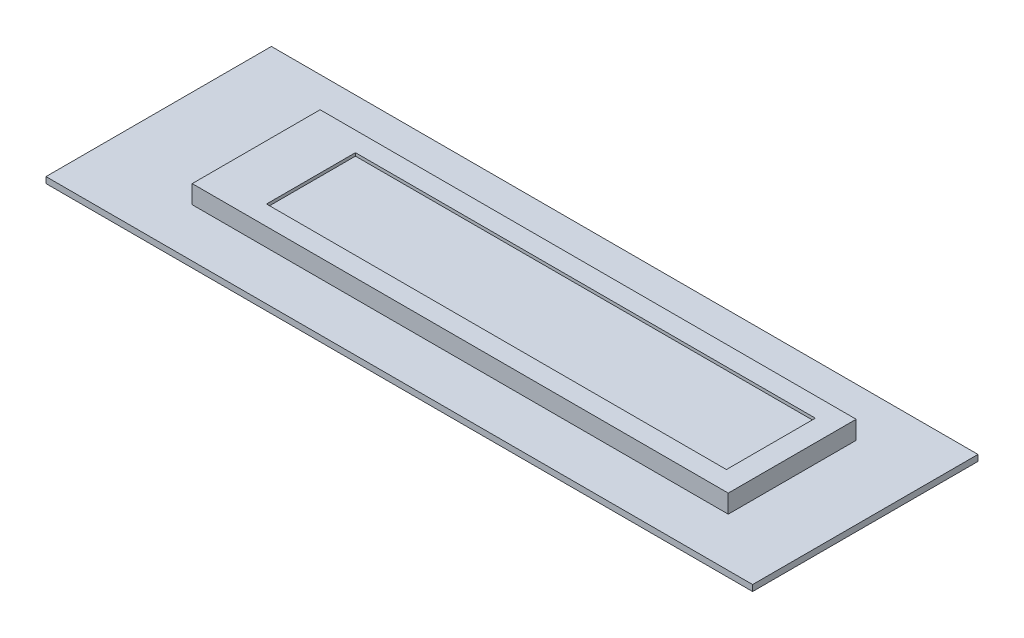
ISO-10303-21;
HEADER;
FILE_DESCRIPTION(('STEP AP214'),'2;1');
FILE_NAME('part.step','',(''),(''),'','','');
FILE_SCHEMA(('AUTOMOTIVE_DESIGN { 1 0 10303 214 1 1 1 1 }'));
ENDSEC;
DATA;
#1=APPLICATION_CONTEXT('core data for automotive mechanical design processes');
#2=APPLICATION_PROTOCOL_DEFINITION('international standard','automotive_design',2000,#1);
#3=PRODUCT_CONTEXT('',#1,'mechanical');
#4=PRODUCT('Part','Part','',(#3));
#5=PRODUCT_RELATED_PRODUCT_CATEGORY('part','',(#4));
#6=PRODUCT_DEFINITION_FORMATION('','',#4);
#7=PRODUCT_DEFINITION_CONTEXT('part definition',#1,'design');
#8=PRODUCT_DEFINITION('design','',#6,#7);
#9=PRODUCT_DEFINITION_SHAPE('','',#8);
#10=(LENGTH_UNIT() NAMED_UNIT(*) SI_UNIT(.MILLI.,.METRE.));
#11=(NAMED_UNIT(*) PLANE_ANGLE_UNIT() SI_UNIT($,.RADIAN.));
#12=(NAMED_UNIT(*) SI_UNIT($,.STERADIAN.) SOLID_ANGLE_UNIT());
#13=UNCERTAINTY_MEASURE_WITH_UNIT(LENGTH_MEASURE(1.E-05),#10,'distance_accuracy_value','');
#14=(GEOMETRIC_REPRESENTATION_CONTEXT(3) GLOBAL_UNCERTAINTY_ASSIGNED_CONTEXT((#13)) GLOBAL_UNIT_ASSIGNED_CONTEXT((#10,
#11,#12)) REPRESENTATION_CONTEXT('',''));
#15=CARTESIAN_POINT('',(0.,0.,0.));
#16=DIRECTION('',(0.,0.,1.));
#17=DIRECTION('',(1.,0.,0.));
#18=AXIS2_PLACEMENT_3D('',#15,#16,#17);
#19=CARTESIAN_POINT('',(0.,1.,0.));
#20=DIRECTION('',(0.,1.,0.));
#21=DIRECTION('',(0.,0.,1.));
#22=AXIS2_PLACEMENT_3D('',#19,#20,#21);
#23=PLANE('',#22);
#24=DIRECTION('',(0.,0.,-1.));
#25=VECTOR('',#24,1.);
#26=CARTESIAN_POINT('',(58.,1.,-18.5));
#27=LINE('',#26,#25);
#28=CARTESIAN_POINT('',(58.,1.,18.5));
#29=VERTEX_POINT('',#28);
#30=CARTESIAN_POINT('',(58.,1.,-18.5));
#31=VERTEX_POINT('',#30);
#32=EDGE_CURVE('E189',#29,#31,#27,.T.);
#33=ORIENTED_EDGE('',*,*,#32,.T.);
#34=DIRECTION('',(-1.,0.,0.));
#35=VECTOR('',#34,1.);
#36=CARTESIAN_POINT('',(-58.,1.,-18.5));
#37=LINE('',#36,#35);
#38=CARTESIAN_POINT('',(-58.,1.,-18.5));
#39=VERTEX_POINT('',#38);
#40=EDGE_CURVE('E192',#31,#39,#37,.T.);
#41=ORIENTED_EDGE('',*,*,#40,.T.);
#42=DIRECTION('',(0.,0.,1.));
#43=VECTOR('',#42,1.);
#44=CARTESIAN_POINT('',(-58.,1.,-18.5));
#45=LINE('',#44,#43);
#46=CARTESIAN_POINT('',(-58.,1.,18.5));
#47=VERTEX_POINT('',#46);
#48=EDGE_CURVE('E195',#39,#47,#45,.T.);
#49=ORIENTED_EDGE('',*,*,#48,.T.);
#50=DIRECTION('',(1.,0.,0.));
#51=VECTOR('',#50,1.);
#52=CARTESIAN_POINT('',(-58.,1.,18.5));
#53=LINE('',#52,#51);
#54=EDGE_CURVE('E197',#47,#29,#53,.T.);
#55=ORIENTED_EDGE('',*,*,#54,.T.);
#56=EDGE_LOOP('',(#33,#41,#49,#55));
#57=FACE_BOUND('',#56,.T.);
#58=DIRECTION('',(-1.,0.,0.));
#59=VECTOR('',#58,1.);
#60=CARTESIAN_POINT('',(-42.,1.,-10.5));
#61=LINE('',#60,#59);
#62=CARTESIAN_POINT('',(46.,1.,-10.5));
#63=VERTEX_POINT('',#62);
#64=CARTESIAN_POINT('',(-42.,1.,-10.5));
#65=VERTEX_POINT('',#64);
#66=EDGE_CURVE('E175',#63,#65,#61,.T.);
#67=ORIENTED_EDGE('',*,*,#66,.F.);
#68=DIRECTION('',(0.,0.,-1.));
#69=VECTOR('',#68,1.);
#70=CARTESIAN_POINT('',(46.,1.,-10.5));
#71=LINE('',#70,#69);
#72=CARTESIAN_POINT('',(46.,1.,10.5));
#73=VERTEX_POINT('',#72);
#74=EDGE_CURVE('E158',#73,#63,#71,.T.);
#75=ORIENTED_EDGE('',*,*,#74,.F.);
#76=DIRECTION('',(1.,0.,0.));
#77=VECTOR('',#76,1.);
#78=CARTESIAN_POINT('',(-42.,1.,10.5));
#79=LINE('',#78,#77);
#80=CARTESIAN_POINT('',(-42.,1.,10.5));
#81=VERTEX_POINT('',#80);
#82=EDGE_CURVE('E166',#81,#73,#79,.T.);
#83=ORIENTED_EDGE('',*,*,#82,.F.);
#84=DIRECTION('',(0.,0.,1.));
#85=VECTOR('',#84,1.);
#86=CARTESIAN_POINT('',(-42.,1.,-10.5));
#87=LINE('',#86,#85);
#88=EDGE_CURVE('E177',#65,#81,#87,.T.);
#89=ORIENTED_EDGE('',*,*,#88,.F.);
#90=EDGE_LOOP('',(#67,#75,#83,#89));
#91=FACE_BOUND('',#90,.T.);
#92=ADVANCED_FACE('F33',(#57,#91),#23,.T.);
#93=CARTESIAN_POINT('',(58.,1.,-18.5));
#94=DIRECTION('',(-1.,0.,0.));
#95=DIRECTION('',(0.,0.,1.));
#96=AXIS2_PLACEMENT_3D('',#93,#94,#95);
#97=PLANE('',#96);
#98=DIRECTION('',(0.,0.,-1.));
#99=VECTOR('',#98,1.);
#100=CARTESIAN_POINT('',(58.,0.,-18.5));
#101=LINE('',#100,#99);
#102=CARTESIAN_POINT('',(58.,0.,18.5));
#103=VERTEX_POINT('',#102);
#104=CARTESIAN_POINT('',(58.,0.,-18.5));
#105=VERTEX_POINT('',#104);
#106=EDGE_CURVE('E188',#103,#105,#101,.T.);
#107=ORIENTED_EDGE('',*,*,#106,.T.);
#108=DIRECTION('',(0.,-1.,0.));
#109=VECTOR('',#108,1.);
#110=CARTESIAN_POINT('',(58.,1.,-18.5));
#111=LINE('',#110,#109);
#112=EDGE_CURVE('E11',#31,#105,#111,.T.);
#113=ORIENTED_EDGE('',*,*,#112,.F.);
#114=ORIENTED_EDGE('',*,*,#32,.F.);
#115=DIRECTION('',(0.,-1.,0.));
#116=VECTOR('',#115,1.);
#117=CARTESIAN_POINT('',(58.,1.,18.5));
#118=LINE('',#117,#116);
#119=EDGE_CURVE('E199',#29,#103,#118,.T.);
#120=ORIENTED_EDGE('',*,*,#119,.T.);
#121=EDGE_LOOP('',(#107,#113,#114,#120));
#122=FACE_BOUND('',#121,.T.);
#123=ADVANCED_FACE('F35',(#122),#97,.F.);
#124=CARTESIAN_POINT('',(-58.,1.,-18.5));
#125=DIRECTION('',(0.,0.,1.));
#126=DIRECTION('',(1.,0.,0.));
#127=AXIS2_PLACEMENT_3D('',#124,#125,#126);
#128=PLANE('',#127);
#129=DIRECTION('',(-1.,0.,0.));
#130=VECTOR('',#129,1.);
#131=CARTESIAN_POINT('',(-58.,0.,-18.5));
#132=LINE('',#131,#130);
#133=CARTESIAN_POINT('',(-58.,0.,-18.5));
#134=VERTEX_POINT('',#133);
#135=EDGE_CURVE('E202',#105,#134,#132,.T.);
#136=ORIENTED_EDGE('',*,*,#135,.T.);
#137=DIRECTION('',(0.,-1.,0.));
#138=VECTOR('',#137,1.);
#139=CARTESIAN_POINT('',(-58.,1.,-18.5));
#140=LINE('',#139,#138);
#141=EDGE_CURVE('E41',#39,#134,#140,.T.);
#142=ORIENTED_EDGE('',*,*,#141,.F.);
#143=ORIENTED_EDGE('',*,*,#40,.F.);
#144=ORIENTED_EDGE('',*,*,#112,.T.);
#145=EDGE_LOOP('',(#136,#142,#143,#144));
#146=FACE_BOUND('',#145,.T.);
#147=ADVANCED_FACE('F232',(#146),#128,.F.);
#148=CARTESIAN_POINT('',(-58.,1.,-18.5));
#149=DIRECTION('',(1.,0.,0.));
#150=DIRECTION('',(0.,0.,-1.));
#151=AXIS2_PLACEMENT_3D('',#148,#149,#150);
#152=PLANE('',#151);
#153=DIRECTION('',(0.,0.,1.));
#154=VECTOR('',#153,1.);
#155=CARTESIAN_POINT('',(-58.,0.,-18.5));
#156=LINE('',#155,#154);
#157=CARTESIAN_POINT('',(-58.,0.,18.5));
#158=VERTEX_POINT('',#157);
#159=EDGE_CURVE('E204',#134,#158,#156,.T.);
#160=ORIENTED_EDGE('',*,*,#159,.T.);
#161=DIRECTION('',(0.,-1.,0.));
#162=VECTOR('',#161,1.);
#163=CARTESIAN_POINT('',(-58.,1.,18.5));
#164=LINE('',#163,#162);
#165=EDGE_CURVE('E209',#47,#158,#164,.T.);
#166=ORIENTED_EDGE('',*,*,#165,.F.);
#167=ORIENTED_EDGE('',*,*,#48,.F.);
#168=ORIENTED_EDGE('',*,*,#141,.T.);
#169=EDGE_LOOP('',(#160,#166,#167,#168));
#170=FACE_BOUND('',#169,.T.);
#171=ADVANCED_FACE('F216',(#170),#152,.F.);
#172=CARTESIAN_POINT('',(-58.,1.,18.5));
#173=DIRECTION('',(0.,0.,-1.));
#174=DIRECTION('',(-1.,0.,0.));
#175=AXIS2_PLACEMENT_3D('',#172,#173,#174);
#176=PLANE('',#175);
#177=DIRECTION('',(1.,0.,0.));
#178=VECTOR('',#177,1.);
#179=CARTESIAN_POINT('',(-58.,0.,18.5));
#180=LINE('',#179,#178);
#181=EDGE_CURVE('E193',#158,#103,#180,.T.);
#182=ORIENTED_EDGE('',*,*,#181,.T.);
#183=ORIENTED_EDGE('',*,*,#119,.F.);
#184=ORIENTED_EDGE('',*,*,#54,.F.);
#185=ORIENTED_EDGE('',*,*,#165,.T.);
#186=EDGE_LOOP('',(#182,#183,#184,#185));
#187=FACE_BOUND('',#186,.T.);
#188=ADVANCED_FACE('F225',(#187),#176,.F.);
#189=CARTESIAN_POINT('',(0.,0.,0.));
#190=DIRECTION('',(0.,1.,0.));
#191=DIRECTION('',(0.,0.,1.));
#192=AXIS2_PLACEMENT_3D('',#189,#190,#191);
#193=PLANE('',#192);
#194=ORIENTED_EDGE('',*,*,#106,.F.);
#195=ORIENTED_EDGE('',*,*,#181,.F.);
#196=ORIENTED_EDGE('',*,*,#159,.F.);
#197=ORIENTED_EDGE('',*,*,#135,.F.);
#198=EDGE_LOOP('',(#194,#195,#196,#197));
#199=FACE_BOUND('',#198,.T.);
#200=ADVANCED_FACE('F222',(#199),#193,.F.);
#201=CARTESIAN_POINT('',(46.,4.,-10.5));
#202=DIRECTION('',(-1.,0.,0.));
#203=DIRECTION('',(0.,0.,1.));
#204=AXIS2_PLACEMENT_3D('',#201,#202,#203);
#205=PLANE('',#204);
#206=ORIENTED_EDGE('',*,*,#74,.T.);
#207=DIRECTION('',(0.,-1.,0.));
#208=VECTOR('',#207,1.);
#209=CARTESIAN_POINT('',(46.,4.,-10.5));
#210=LINE('',#209,#208);
#211=CARTESIAN_POINT('',(46.,4.,-10.5));
#212=VERTEX_POINT('',#211);
#213=EDGE_CURVE('E186',#212,#63,#210,.T.);
#214=ORIENTED_EDGE('',*,*,#213,.F.);
#215=DIRECTION('',(0.,0.,-1.));
#216=VECTOR('',#215,1.);
#217=CARTESIAN_POINT('',(46.,4.,-10.5));
#218=LINE('',#217,#216);
#219=CARTESIAN_POINT('',(46.,4.,10.5));
#220=VERTEX_POINT('',#219);
#221=EDGE_CURVE('E162',#220,#212,#218,.T.);
#222=ORIENTED_EDGE('',*,*,#221,.F.);
#223=DIRECTION('',(0.,-1.,0.));
#224=VECTOR('',#223,1.);
#225=CARTESIAN_POINT('',(46.,4.,10.5));
#226=LINE('',#225,#224);
#227=EDGE_CURVE('E172',#220,#73,#226,.T.);
#228=ORIENTED_EDGE('',*,*,#227,.T.);
#229=EDGE_LOOP('',(#206,#214,#222,#228));
#230=FACE_BOUND('',#229,.T.);
#231=ADVANCED_FACE('F245',(#230),#205,.F.);
#232=CARTESIAN_POINT('',(-42.,4.,-10.5));
#233=DIRECTION('',(0.,0.,1.));
#234=DIRECTION('',(1.,0.,0.));
#235=AXIS2_PLACEMENT_3D('',#232,#233,#234);
#236=PLANE('',#235);
#237=ORIENTED_EDGE('',*,*,#66,.T.);
#238=DIRECTION('',(0.,-1.,0.));
#239=VECTOR('',#238,1.);
#240=CARTESIAN_POINT('',(-42.,4.,-10.5));
#241=LINE('',#240,#239);
#242=CARTESIAN_POINT('',(-42.,4.,-10.5));
#243=VERTEX_POINT('',#242);
#244=EDGE_CURVE('E183',#243,#65,#241,.T.);
#245=ORIENTED_EDGE('',*,*,#244,.F.);
#246=DIRECTION('',(-1.,0.,0.));
#247=VECTOR('',#246,1.);
#248=CARTESIAN_POINT('',(-42.,4.,-10.5));
#249=LINE('',#248,#247);
#250=EDGE_CURVE('E165',#212,#243,#249,.T.);
#251=ORIENTED_EDGE('',*,*,#250,.F.);
#252=ORIENTED_EDGE('',*,*,#213,.T.);
#253=EDGE_LOOP('',(#237,#245,#251,#252));
#254=FACE_BOUND('',#253,.T.);
#255=ADVANCED_FACE('F264',(#254),#236,.F.);
#256=CARTESIAN_POINT('',(-42.,4.,-10.5));
#257=DIRECTION('',(1.,0.,0.));
#258=DIRECTION('',(0.,0.,-1.));
#259=AXIS2_PLACEMENT_3D('',#256,#257,#258);
#260=PLANE('',#259);
#261=ORIENTED_EDGE('',*,*,#88,.T.);
#262=DIRECTION('',(0.,-1.,0.));
#263=VECTOR('',#262,1.);
#264=CARTESIAN_POINT('',(-42.,4.,10.5));
#265=LINE('',#264,#263);
#266=CARTESIAN_POINT('',(-42.,4.,10.5));
#267=VERTEX_POINT('',#266);
#268=EDGE_CURVE('E56',#267,#81,#265,.T.);
#269=ORIENTED_EDGE('',*,*,#268,.F.);
#270=DIRECTION('',(0.,0.,1.));
#271=VECTOR('',#270,1.);
#272=CARTESIAN_POINT('',(-42.,4.,-10.5));
#273=LINE('',#272,#271);
#274=EDGE_CURVE('E168',#243,#267,#273,.T.);
#275=ORIENTED_EDGE('',*,*,#274,.F.);
#276=ORIENTED_EDGE('',*,*,#244,.T.);
#277=EDGE_LOOP('',(#261,#269,#275,#276));
#278=FACE_BOUND('',#277,.T.);
#279=ADVANCED_FACE('F271',(#278),#260,.F.);
#280=CARTESIAN_POINT('',(-42.,4.,10.5));
#281=DIRECTION('',(0.,0.,-1.));
#282=DIRECTION('',(-1.,0.,0.));
#283=AXIS2_PLACEMENT_3D('',#280,#281,#282);
#284=PLANE('',#283);
#285=ORIENTED_EDGE('',*,*,#82,.T.);
#286=ORIENTED_EDGE('',*,*,#227,.F.);
#287=DIRECTION('',(1.,0.,0.));
#288=VECTOR('',#287,1.);
#289=CARTESIAN_POINT('',(-42.,4.,10.5));
#290=LINE('',#289,#288);
#291=EDGE_CURVE('E170',#267,#220,#290,.T.);
#292=ORIENTED_EDGE('',*,*,#291,.F.);
#293=ORIENTED_EDGE('',*,*,#268,.T.);
#294=EDGE_LOOP('',(#285,#286,#292,#293));
#295=FACE_BOUND('',#294,.T.);
#296=ADVANCED_FACE('F278',(#295),#284,.F.);
#297=CARTESIAN_POINT('',(0.,4.,0.));
#298=DIRECTION('',(0.,1.,0.));
#299=DIRECTION('',(0.,0.,1.));
#300=AXIS2_PLACEMENT_3D('',#297,#298,#299);
#301=PLANE('',#300);
#302=DIRECTION('',(0.,0.,1.));
#303=VECTOR('',#302,1.);
#304=CARTESIAN_POINT('',(-33.,4.,-7.3));
#305=LINE('',#304,#303);
#306=CARTESIAN_POINT('',(-33.,4.,-7.3));
#307=VERTEX_POINT('',#306);
#308=CARTESIAN_POINT('',(-33.,4.,7.30000000000001));
#309=VERTEX_POINT('',#308);
#310=EDGE_CURVE('E48',#307,#309,#305,.T.);
#311=ORIENTED_EDGE('',*,*,#310,.F.);
#312=DIRECTION('',(-1.,0.,0.));
#313=VECTOR('',#312,1.);
#314=CARTESIAN_POINT('',(-33.,4.,-7.3));
#315=LINE('',#314,#313);
#316=CARTESIAN_POINT('',(42.5,4.,-7.30000000000005));
#317=VERTEX_POINT('',#316);
#318=EDGE_CURVE('E143',#317,#307,#315,.T.);
#319=ORIENTED_EDGE('',*,*,#318,.F.);
#320=DIRECTION('',(0.,0.,-1.));
#321=VECTOR('',#320,1.);
#322=CARTESIAN_POINT('',(42.5,4.,-7.30000000000005));
#323=LINE('',#322,#321);
#324=CARTESIAN_POINT('',(42.5,4.,7.30000000000001));
#325=VERTEX_POINT('',#324);
#326=EDGE_CURVE('E146',#325,#317,#323,.T.);
#327=ORIENTED_EDGE('',*,*,#326,.F.);
#328=DIRECTION('',(1.,0.,0.));
#329=VECTOR('',#328,1.);
#330=CARTESIAN_POINT('',(-33.,4.,7.30000000000001));
#331=LINE('',#330,#329);
#332=EDGE_CURVE('E152',#309,#325,#331,.T.);
#333=ORIENTED_EDGE('',*,*,#332,.F.);
#334=EDGE_LOOP('',(#311,#319,#327,#333));
#335=FACE_BOUND('',#334,.T.);
#336=ORIENTED_EDGE('',*,*,#221,.T.);
#337=ORIENTED_EDGE('',*,*,#250,.T.);
#338=ORIENTED_EDGE('',*,*,#274,.T.);
#339=ORIENTED_EDGE('',*,*,#291,.T.);
#340=EDGE_LOOP('',(#336,#337,#338,#339));
#341=FACE_BOUND('',#340,.T.);
#342=ADVANCED_FACE('F286',(#335,#341),#301,.T.);
#343=CARTESIAN_POINT('',(-33.,3.5,-7.3));
#344=DIRECTION('',(-1.,0.,0.));
#345=DIRECTION('',(0.,0.,1.));
#346=AXIS2_PLACEMENT_3D('',#343,#344,#345);
#347=PLANE('',#346);
#348=ORIENTED_EDGE('',*,*,#310,.T.);
#349=DIRECTION('',(0.,1.,0.));
#350=VECTOR('',#349,1.);
#351=CARTESIAN_POINT('',(-33.,3.5,7.30000000000001));
#352=LINE('',#351,#350);
#353=CARTESIAN_POINT('',(-33.,3.5,7.30000000000001));
#354=VERTEX_POINT('',#353);
#355=EDGE_CURVE('E121',#354,#309,#352,.T.);
#356=ORIENTED_EDGE('',*,*,#355,.F.);
#357=DIRECTION('',(0.,0.,1.));
#358=VECTOR('',#357,1.);
#359=CARTESIAN_POINT('',(-33.,3.5,-7.3));
#360=LINE('',#359,#358);
#361=CARTESIAN_POINT('',(-33.,3.5,-7.3));
#362=VERTEX_POINT('',#361);
#363=EDGE_CURVE('E125',#362,#354,#360,.T.);
#364=ORIENTED_EDGE('',*,*,#363,.F.);
#365=DIRECTION('',(0.,1.,0.));
#366=VECTOR('',#365,1.);
#367=CARTESIAN_POINT('',(-33.,3.5,-7.3));
#368=LINE('',#367,#366);
#369=EDGE_CURVE('E156',#362,#307,#368,.T.);
#370=ORIENTED_EDGE('',*,*,#369,.T.);
#371=EDGE_LOOP('',(#348,#356,#364,#370));
#372=FACE_BOUND('',#371,.T.);
#373=ADVANCED_FACE('F123',(#372),#347,.F.);
#374=CARTESIAN_POINT('',(-33.,3.5,-7.3));
#375=DIRECTION('',(0.,0.,-1.));
#376=DIRECTION('',(-1.,0.,0.));
#377=AXIS2_PLACEMENT_3D('',#374,#375,#376);
#378=PLANE('',#377);
#379=ORIENTED_EDGE('',*,*,#318,.T.);
#380=ORIENTED_EDGE('',*,*,#369,.F.);
#381=DIRECTION('',(-1.,0.,0.));
#382=VECTOR('',#381,1.);
#383=CARTESIAN_POINT('',(-33.,3.5,-7.3));
#384=LINE('',#383,#382);
#385=CARTESIAN_POINT('',(42.5,3.5,-7.30000000000005));
#386=VERTEX_POINT('',#385);
#387=EDGE_CURVE('E131',#386,#362,#384,.T.);
#388=ORIENTED_EDGE('',*,*,#387,.F.);
#389=DIRECTION('',(0.,1.,0.));
#390=VECTOR('',#389,1.);
#391=CARTESIAN_POINT('',(42.5,3.5,-7.30000000000005));
#392=LINE('',#391,#390);
#393=EDGE_CURVE('E159',#386,#317,#392,.T.);
#394=ORIENTED_EDGE('',*,*,#393,.T.);
#395=EDGE_LOOP('',(#379,#380,#388,#394));
#396=FACE_BOUND('',#395,.T.);
#397=ADVANCED_FACE('F303',(#396),#378,.F.);
#398=CARTESIAN_POINT('',(42.5,3.5,-7.30000000000005));
#399=DIRECTION('',(1.,0.,0.));
#400=DIRECTION('',(0.,0.,-1.));
#401=AXIS2_PLACEMENT_3D('',#398,#399,#400);
#402=PLANE('',#401);
#403=ORIENTED_EDGE('',*,*,#326,.T.);
#404=ORIENTED_EDGE('',*,*,#393,.F.);
#405=DIRECTION('',(0.,0.,-1.));
#406=VECTOR('',#405,1.);
#407=CARTESIAN_POINT('',(42.5,3.5,-7.30000000000005));
#408=LINE('',#407,#406);
#409=CARTESIAN_POINT('',(42.5,3.5,7.30000000000001));
#410=VERTEX_POINT('',#409);
#411=EDGE_CURVE('E139',#410,#386,#408,.T.);
#412=ORIENTED_EDGE('',*,*,#411,.F.);
#413=DIRECTION('',(0.,1.,0.));
#414=VECTOR('',#413,1.);
#415=CARTESIAN_POINT('',(42.5,3.5,7.30000000000001));
#416=LINE('',#415,#414);
#417=EDGE_CURVE('E130',#410,#325,#416,.T.);
#418=ORIENTED_EDGE('',*,*,#417,.T.);
#419=EDGE_LOOP('',(#403,#404,#412,#418));
#420=FACE_BOUND('',#419,.T.);
#421=ADVANCED_FACE('F309',(#420),#402,.F.);
#422=CARTESIAN_POINT('',(-33.,3.5,7.30000000000001));
#423=DIRECTION('',(0.,0.,1.));
#424=DIRECTION('',(1.,0.,0.));
#425=AXIS2_PLACEMENT_3D('',#422,#423,#424);
#426=PLANE('',#425);
#427=ORIENTED_EDGE('',*,*,#332,.T.);
#428=ORIENTED_EDGE('',*,*,#417,.F.);
#429=DIRECTION('',(1.,0.,0.));
#430=VECTOR('',#429,1.);
#431=CARTESIAN_POINT('',(-33.,3.5,7.30000000000001));
#432=LINE('',#431,#430);
#433=EDGE_CURVE('E134',#354,#410,#432,.T.);
#434=ORIENTED_EDGE('',*,*,#433,.F.);
#435=ORIENTED_EDGE('',*,*,#355,.T.);
#436=EDGE_LOOP('',(#427,#428,#434,#435));
#437=FACE_BOUND('',#436,.T.);
#438=ADVANCED_FACE('F135',(#437),#426,.F.);
#439=CARTESIAN_POINT('',(0.,3.5,0.));
#440=DIRECTION('',(0.,1.,0.));
#441=DIRECTION('',(0.,0.,1.));
#442=AXIS2_PLACEMENT_3D('',#439,#440,#441);
#443=PLANE('',#442);
#444=ORIENTED_EDGE('',*,*,#363,.T.);
#445=ORIENTED_EDGE('',*,*,#433,.T.);
#446=ORIENTED_EDGE('',*,*,#411,.T.);
#447=ORIENTED_EDGE('',*,*,#387,.T.);
#448=EDGE_LOOP('',(#444,#445,#446,#447));
#449=FACE_BOUND('',#448,.T.);
#450=ADVANCED_FACE('F141',(#449),#443,.T.);
#451=CLOSED_SHELL('',(#92,#123,#147,#171,#188,#200,#231,#255,#279,#296,#342,#373,#397,#421,#438,#450));
#452=MANIFOLD_SOLID_BREP('B2',#451);
#453=ADVANCED_BREP_SHAPE_REPRESENTATION('',(#18,#452),#14);
#454=SHAPE_DEFINITION_REPRESENTATION(#9,#453);
ENDSEC;
END-ISO-10303-21;
